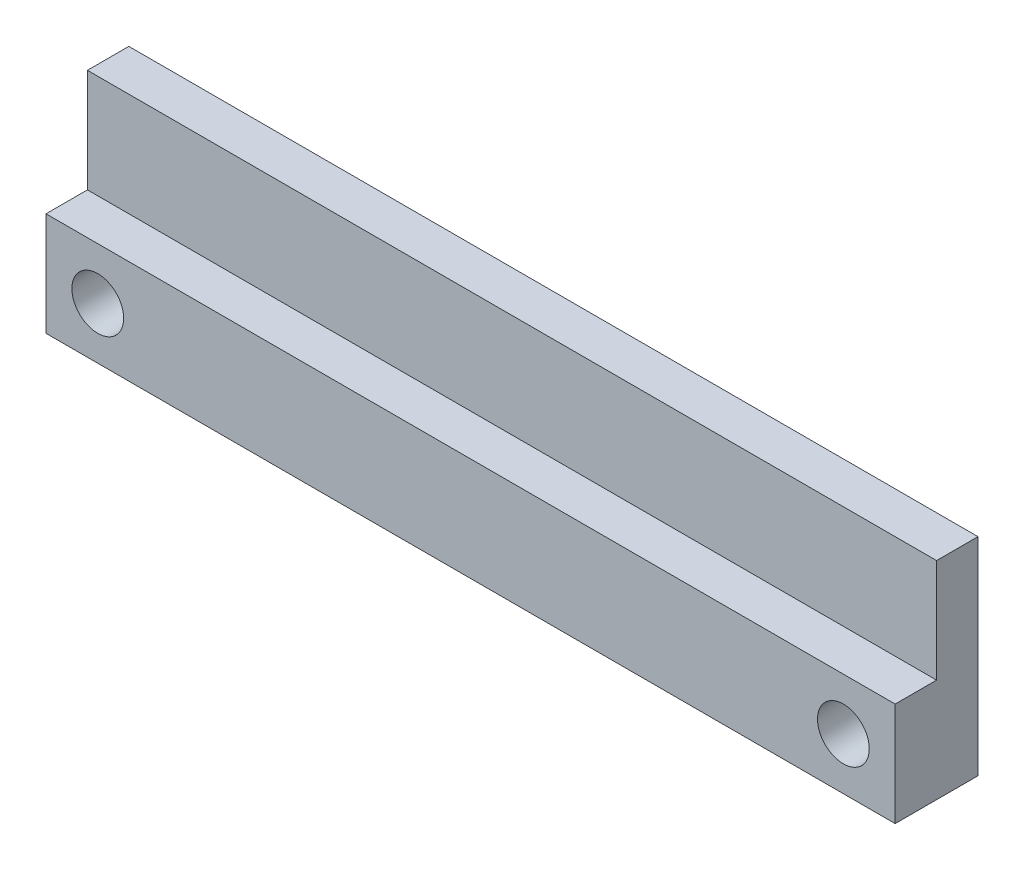
ISO-10303-21;
HEADER;
FILE_DESCRIPTION(('STEP AP214'),'2;1');
FILE_NAME('part.step','',(''),(''),'','','');
FILE_SCHEMA(('AUTOMOTIVE_DESIGN { 1 0 10303 214 1 1 1 1 }'));
ENDSEC;
DATA;
#1=APPLICATION_CONTEXT('core data for automotive mechanical design processes');
#2=APPLICATION_PROTOCOL_DEFINITION('international standard','automotive_design',2000,#1);
#3=PRODUCT_CONTEXT('',#1,'mechanical');
#4=PRODUCT('Part','Part','',(#3));
#5=PRODUCT_RELATED_PRODUCT_CATEGORY('part','',(#4));
#6=PRODUCT_DEFINITION_FORMATION('','',#4);
#7=PRODUCT_DEFINITION_CONTEXT('part definition',#1,'design');
#8=PRODUCT_DEFINITION('design','',#6,#7);
#9=PRODUCT_DEFINITION_SHAPE('','',#8);
#10=(LENGTH_UNIT() NAMED_UNIT(*) SI_UNIT(.MILLI.,.METRE.));
#11=(NAMED_UNIT(*) PLANE_ANGLE_UNIT() SI_UNIT($,.RADIAN.));
#12=(NAMED_UNIT(*) SI_UNIT($,.STERADIAN.) SOLID_ANGLE_UNIT());
#13=UNCERTAINTY_MEASURE_WITH_UNIT(LENGTH_MEASURE(1.E-05),#10,'distance_accuracy_value','');
#14=(GEOMETRIC_REPRESENTATION_CONTEXT(3) GLOBAL_UNCERTAINTY_ASSIGNED_CONTEXT((#13)) GLOBAL_UNIT_ASSIGNED_CONTEXT((#10,
#11,#12)) REPRESENTATION_CONTEXT('',''));
#15=CARTESIAN_POINT('',(0.,0.,0.));
#16=DIRECTION('',(0.,0.,1.));
#17=DIRECTION('',(1.,0.,0.));
#18=AXIS2_PLACEMENT_3D('',#15,#16,#17);
#19=CARTESIAN_POINT('',(-15.8230805873703,10.9075471698113,2.));
#20=DIRECTION('',(1.,0.,0.));
#21=DIRECTION('',(0.,1.,0.));
#22=AXIS2_PLACEMENT_3D('',#19,#20,#21);
#23=PLANE('',#22);
#24=DIRECTION('',(0.,-1.,0.));
#25=VECTOR('',#24,1.);
#26=CARTESIAN_POINT('',(-15.8230805873703,10.9075471698113,0.));
#27=LINE('',#26,#25);
#28=CARTESIAN_POINT('',(-15.8230805873703,10.9075471698113,0.));
#29=VERTEX_POINT('',#28);
#30=CARTESIAN_POINT('',(-15.8230805873703,0.907547169811325,0.));
#31=VERTEX_POINT('',#30);
#32=EDGE_CURVE('E92',#29,#31,#27,.T.);
#33=ORIENTED_EDGE('',*,*,#32,.T.);
#34=DIRECTION('',(0.,0.,-1.));
#35=VECTOR('',#34,1.);
#36=CARTESIAN_POINT('',(-15.8230805873703,0.907547169811325,2.));
#37=LINE('',#36,#35);
#38=CARTESIAN_POINT('',(-15.8230805873703,0.907547169811325,4.));
#39=VERTEX_POINT('',#38);
#40=EDGE_CURVE('E11',#39,#31,#37,.T.);
#41=ORIENTED_EDGE('',*,*,#40,.F.);
#42=DIRECTION('',(0.,-1.,0.));
#43=VECTOR('',#42,1.);
#44=CARTESIAN_POINT('',(-15.8230805873703,0.907547169811325,4.));
#45=LINE('',#44,#43);
#46=CARTESIAN_POINT('',(-15.8230805873703,5.90754716981133,4.));
#47=VERTEX_POINT('',#46);
#48=EDGE_CURVE('E129',#47,#39,#45,.T.);
#49=ORIENTED_EDGE('',*,*,#48,.F.);
#50=DIRECTION('',(0.,0.,-1.));
#51=VECTOR('',#50,1.);
#52=CARTESIAN_POINT('',(-15.8230805873703,5.90754716981133,4.));
#53=LINE('',#52,#51);
#54=CARTESIAN_POINT('',(-15.8230805873703,5.90754716981133,2.));
#55=VERTEX_POINT('',#54);
#56=EDGE_CURVE('E101',#47,#55,#53,.T.);
#57=ORIENTED_EDGE('',*,*,#56,.T.);
#58=DIRECTION('',(0.,-1.,0.));
#59=VECTOR('',#58,1.);
#60=CARTESIAN_POINT('',(-15.8230805873703,10.9075471698113,2.));
#61=LINE('',#60,#59);
#62=CARTESIAN_POINT('',(-15.8230805873703,10.9075471698113,2.));
#63=VERTEX_POINT('',#62);
#64=EDGE_CURVE('E86',#63,#55,#61,.T.);
#65=ORIENTED_EDGE('',*,*,#64,.F.);
#66=DIRECTION('',(0.,0.,-1.));
#67=VECTOR('',#66,1.);
#68=CARTESIAN_POINT('',(-15.8230805873703,10.9075471698113,2.));
#69=LINE('',#68,#67);
#70=EDGE_CURVE('E79',#63,#29,#69,.T.);
#71=ORIENTED_EDGE('',*,*,#70,.T.);
#72=EDGE_LOOP('',(#33,#41,#49,#57,#65,#71));
#73=FACE_BOUND('',#72,.T.);
#74=ADVANCED_FACE('F37',(#73),#23,.F.);
#75=CARTESIAN_POINT('',(-15.8230805873703,0.907547169811325,2.));
#76=DIRECTION('',(0.,1.,0.));
#77=DIRECTION('',(0.,0.,1.));
#78=AXIS2_PLACEMENT_3D('',#75,#76,#77);
#79=PLANE('',#78);
#80=DIRECTION('',(1.,0.,0.));
#81=VECTOR('',#80,1.);
#82=CARTESIAN_POINT('',(-15.8230805873703,0.907547169811325,0.));
#83=LINE('',#82,#81);
#84=CARTESIAN_POINT('',(25.1769194126297,0.907547169811325,0.));
#85=VERTEX_POINT('',#84);
#86=EDGE_CURVE('E96',#31,#85,#83,.T.);
#87=ORIENTED_EDGE('',*,*,#86,.T.);
#88=DIRECTION('',(0.,0.,-1.));
#89=VECTOR('',#88,1.);
#90=CARTESIAN_POINT('',(25.1769194126297,0.907547169811325,2.));
#91=LINE('',#90,#89);
#92=CARTESIAN_POINT('',(25.1769194126297,0.907547169811325,4.));
#93=VERTEX_POINT('',#92);
#94=EDGE_CURVE('E44',#93,#85,#91,.T.);
#95=ORIENTED_EDGE('',*,*,#94,.F.);
#96=DIRECTION('',(1.,0.,0.));
#97=VECTOR('',#96,1.);
#98=CARTESIAN_POINT('',(-15.8230805873703,0.907547169811325,4.));
#99=LINE('',#98,#97);
#100=EDGE_CURVE('E121',#39,#93,#99,.T.);
#101=ORIENTED_EDGE('',*,*,#100,.F.);
#102=ORIENTED_EDGE('',*,*,#40,.T.);
#103=EDGE_LOOP('',(#87,#95,#101,#102));
#104=FACE_BOUND('',#103,.T.);
#105=ADVANCED_FACE('F119',(#104),#79,.F.);
#106=CARTESIAN_POINT('',(25.1769194126297,10.9075471698113,2.));
#107=DIRECTION('',(-1.,0.,0.));
#108=DIRECTION('',(0.,-1.,0.));
#109=AXIS2_PLACEMENT_3D('',#106,#107,#108);
#110=PLANE('',#109);
#111=DIRECTION('',(0.,1.,0.));
#112=VECTOR('',#111,1.);
#113=CARTESIAN_POINT('',(25.1769194126297,10.9075471698113,0.));
#114=LINE('',#113,#112);
#115=CARTESIAN_POINT('',(25.1769194126297,10.9075471698113,0.));
#116=VERTEX_POINT('',#115);
#117=EDGE_CURVE('E87',#85,#116,#114,.T.);
#118=ORIENTED_EDGE('',*,*,#117,.T.);
#119=DIRECTION('',(0.,0.,-1.));
#120=VECTOR('',#119,1.);
#121=CARTESIAN_POINT('',(25.1769194126297,10.9075471698113,2.));
#122=LINE('',#121,#120);
#123=CARTESIAN_POINT('',(25.1769194126297,10.9075471698113,2.));
#124=VERTEX_POINT('',#123);
#125=EDGE_CURVE('E82',#124,#116,#122,.T.);
#126=ORIENTED_EDGE('',*,*,#125,.F.);
#127=DIRECTION('',(0.,1.,0.));
#128=VECTOR('',#127,1.);
#129=CARTESIAN_POINT('',(25.1769194126297,10.9075471698113,2.));
#130=LINE('',#129,#128);
#131=CARTESIAN_POINT('',(25.1769194126297,5.90754716981133,2.));
#132=VERTEX_POINT('',#131);
#133=EDGE_CURVE('E140',#132,#124,#130,.T.);
#134=ORIENTED_EDGE('',*,*,#133,.F.);
#135=DIRECTION('',(0.,0.,-1.));
#136=VECTOR('',#135,1.);
#137=CARTESIAN_POINT('',(25.1769194126297,5.90754716981133,4.));
#138=LINE('',#137,#136);
#139=CARTESIAN_POINT('',(25.1769194126297,5.90754716981133,4.));
#140=VERTEX_POINT('',#139);
#141=EDGE_CURVE('E97',#140,#132,#138,.T.);
#142=ORIENTED_EDGE('',*,*,#141,.F.);
#143=DIRECTION('',(0.,1.,0.));
#144=VECTOR('',#143,1.);
#145=CARTESIAN_POINT('',(25.1769194126297,0.907547169811325,4.));
#146=LINE('',#145,#144);
#147=EDGE_CURVE('E115',#93,#140,#146,.T.);
#148=ORIENTED_EDGE('',*,*,#147,.F.);
#149=ORIENTED_EDGE('',*,*,#94,.T.);
#150=EDGE_LOOP('',(#118,#126,#134,#142,#148,#149));
#151=FACE_BOUND('',#150,.T.);
#152=ADVANCED_FACE('F111',(#151),#110,.F.);
#153=CARTESIAN_POINT('',(-15.8230805873703,10.9075471698113,2.));
#154=DIRECTION('',(0.,-1.,0.));
#155=DIRECTION('',(0.,0.,-1.));
#156=AXIS2_PLACEMENT_3D('',#153,#154,#155);
#157=PLANE('',#156);
#158=DIRECTION('',(-1.,0.,0.));
#159=VECTOR('',#158,1.);
#160=CARTESIAN_POINT('',(-15.8230805873703,10.9075471698113,0.));
#161=LINE('',#160,#159);
#162=EDGE_CURVE('E76',#116,#29,#161,.T.);
#163=ORIENTED_EDGE('',*,*,#162,.T.);
#164=ORIENTED_EDGE('',*,*,#70,.F.);
#165=DIRECTION('',(-1.,0.,0.));
#166=VECTOR('',#165,1.);
#167=CARTESIAN_POINT('',(-15.8230805873703,10.9075471698113,2.));
#168=LINE('',#167,#166);
#169=EDGE_CURVE('E57',#124,#63,#168,.T.);
#170=ORIENTED_EDGE('',*,*,#169,.F.);
#171=ORIENTED_EDGE('',*,*,#125,.T.);
#172=EDGE_LOOP('',(#163,#164,#170,#171));
#173=FACE_BOUND('',#172,.T.);
#174=ADVANCED_FACE('F78',(#173),#157,.F.);
#175=CARTESIAN_POINT('',(0.,0.,2.));
#176=DIRECTION('',(0.,0.,1.));
#177=DIRECTION('',(1.,0.,0.));
#178=AXIS2_PLACEMENT_3D('',#175,#176,#177);
#179=PLANE('',#178);
#180=DIRECTION('',(-1.,0.,0.));
#181=VECTOR('',#180,1.);
#182=CARTESIAN_POINT('',(-15.8230805873703,5.90754716981133,2.));
#183=LINE('',#182,#181);
#184=EDGE_CURVE('E51',#132,#55,#183,.T.);
#185=ORIENTED_EDGE('',*,*,#184,.F.);
#186=ORIENTED_EDGE('',*,*,#133,.T.);
#187=ORIENTED_EDGE('',*,*,#169,.T.);
#188=ORIENTED_EDGE('',*,*,#64,.T.);
#189=EDGE_LOOP('',(#185,#186,#187,#188));
#190=FACE_BOUND('',#189,.T.);
#191=ADVANCED_FACE('F141',(#190),#179,.T.);
#192=CARTESIAN_POINT('',(0.,0.,0.));
#193=DIRECTION('',(0.,0.,1.));
#194=DIRECTION('',(1.,0.,0.));
#195=AXIS2_PLACEMENT_3D('',#192,#193,#194);
#196=PLANE('',#195);
#197=CARTESIAN_POINT('',(22.6769194126297,3.40754716981132,0.));
#198=DIRECTION('',(0.,0.,1.));
#199=DIRECTION('',(1.,0.,0.));
#200=AXIS2_PLACEMENT_3D('',#197,#198,#199);
#201=CIRCLE('',#200,1.25);
#202=CARTESIAN_POINT('',(23.9269194126297,3.40754716981132,0.));
#203=VERTEX_POINT('',#202);
#204=EDGE_CURVE('E217',#203,#203,#201,.T.);
#205=ORIENTED_EDGE('',*,*,#204,.T.);
#206=EDGE_LOOP('',(#205));
#207=FACE_BOUND('',#206,.T.);
#208=CARTESIAN_POINT('',(-13.3230805873703,3.40754716981132,0.));
#209=DIRECTION('',(0.,0.,1.));
#210=DIRECTION('',(1.,0.,0.));
#211=AXIS2_PLACEMENT_3D('',#208,#209,#210);
#212=CIRCLE('',#211,1.25);
#213=CARTESIAN_POINT('',(-12.0730805873703,3.40754716981132,0.));
#214=VERTEX_POINT('',#213);
#215=EDGE_CURVE('E138',#214,#214,#212,.T.);
#216=ORIENTED_EDGE('',*,*,#215,.T.);
#217=EDGE_LOOP('',(#216));
#218=FACE_BOUND('',#217,.T.);
#219=ORIENTED_EDGE('',*,*,#32,.F.);
#220=ORIENTED_EDGE('',*,*,#162,.F.);
#221=ORIENTED_EDGE('',*,*,#117,.F.);
#222=ORIENTED_EDGE('',*,*,#86,.F.);
#223=EDGE_LOOP('',(#219,#220,#221,#222));
#224=FACE_BOUND('',#223,.T.);
#225=ADVANCED_FACE('F95',(#207,#218,#224),#196,.F.);
#226=CARTESIAN_POINT('',(-15.8230805873703,5.90754716981133,4.));
#227=DIRECTION('',(0.,-1.,0.));
#228=DIRECTION('',(0.,0.,-1.));
#229=AXIS2_PLACEMENT_3D('',#226,#227,#228);
#230=PLANE('',#229);
#231=ORIENTED_EDGE('',*,*,#184,.T.);
#232=ORIENTED_EDGE('',*,*,#56,.F.);
#233=DIRECTION('',(-1.,0.,0.));
#234=VECTOR('',#233,1.);
#235=CARTESIAN_POINT('',(-15.8230805873703,5.90754716981133,4.));
#236=LINE('',#235,#234);
#237=EDGE_CURVE('E131',#140,#47,#236,.T.);
#238=ORIENTED_EDGE('',*,*,#237,.F.);
#239=ORIENTED_EDGE('',*,*,#141,.T.);
#240=EDGE_LOOP('',(#231,#232,#238,#239));
#241=FACE_BOUND('',#240,.T.);
#242=ADVANCED_FACE('F144',(#241),#230,.F.);
#243=CARTESIAN_POINT('',(0.,0.,4.));
#244=DIRECTION('',(0.,0.,-1.));
#245=DIRECTION('',(-1.,0.,0.));
#246=AXIS2_PLACEMENT_3D('',#243,#244,#245);
#247=PLANE('',#246);
#248=CARTESIAN_POINT('',(22.6769194126297,3.40754716981132,4.));
#249=DIRECTION('',(0.,0.,1.));
#250=DIRECTION('',(1.,0.,0.));
#251=AXIS2_PLACEMENT_3D('',#248,#249,#250);
#252=CIRCLE('',#251,1.25);
#253=CARTESIAN_POINT('',(23.9269194126297,3.40754716981132,4.));
#254=VERTEX_POINT('',#253);
#255=EDGE_CURVE('E220',#254,#254,#252,.T.);
#256=ORIENTED_EDGE('',*,*,#255,.F.);
#257=EDGE_LOOP('',(#256));
#258=FACE_BOUND('',#257,.T.);
#259=CARTESIAN_POINT('',(-13.3230805873703,3.40754716981132,4.));
#260=DIRECTION('',(0.,0.,1.));
#261=DIRECTION('',(1.,0.,0.));
#262=AXIS2_PLACEMENT_3D('',#259,#260,#261);
#263=CIRCLE('',#262,1.25);
#264=CARTESIAN_POINT('',(-12.0730805873703,3.40754716981132,4.));
#265=VERTEX_POINT('',#264);
#266=EDGE_CURVE('E222',#265,#265,#263,.T.);
#267=ORIENTED_EDGE('',*,*,#266,.F.);
#268=EDGE_LOOP('',(#267));
#269=FACE_BOUND('',#268,.T.);
#270=ORIENTED_EDGE('',*,*,#48,.T.);
#271=ORIENTED_EDGE('',*,*,#100,.T.);
#272=ORIENTED_EDGE('',*,*,#147,.T.);
#273=ORIENTED_EDGE('',*,*,#237,.T.);
#274=EDGE_LOOP('',(#270,#271,#272,#273));
#275=FACE_BOUND('',#274,.T.);
#276=ADVANCED_FACE('F126',(#258,#269,#275),#247,.F.);
#277=CARTESIAN_POINT('',(-13.3230805873703,3.40754716981132,0.));
#278=DIRECTION('',(0.,0.,1.));
#279=DIRECTION('',(1.,0.,0.));
#280=AXIS2_PLACEMENT_3D('',#277,#278,#279);
#281=CYLINDRICAL_SURFACE('',#280,1.25);
#282=ORIENTED_EDGE('',*,*,#215,.F.);
#283=EDGE_LOOP('',(#282));
#284=FACE_BOUND('',#283,.T.);
#285=ORIENTED_EDGE('',*,*,#266,.T.);
#286=EDGE_LOOP('',(#285));
#287=FACE_BOUND('',#286,.T.);
#288=ADVANCED_FACE('F156',(#284,#287),#281,.F.);
#289=CARTESIAN_POINT('',(22.6769194126297,3.40754716981132,0.));
#290=DIRECTION('',(0.,0.,1.));
#291=DIRECTION('',(1.,0.,0.));
#292=AXIS2_PLACEMENT_3D('',#289,#290,#291);
#293=CYLINDRICAL_SURFACE('',#292,1.25);
#294=ORIENTED_EDGE('',*,*,#204,.F.);
#295=EDGE_LOOP('',(#294));
#296=FACE_BOUND('',#295,.T.);
#297=ORIENTED_EDGE('',*,*,#255,.T.);
#298=EDGE_LOOP('',(#297));
#299=FACE_BOUND('',#298,.T.);
#300=ADVANCED_FACE('F200',(#296,#299),#293,.F.);
#301=CLOSED_SHELL('',(#74,#105,#152,#174,#191,#225,#242,#276,#288,#300));
#302=MANIFOLD_SOLID_BREP('B2',#301);
#303=ADVANCED_BREP_SHAPE_REPRESENTATION('',(#18,#302),#14);
#304=SHAPE_DEFINITION_REPRESENTATION(#9,#303);
ENDSEC;
END-ISO-10303-21;
